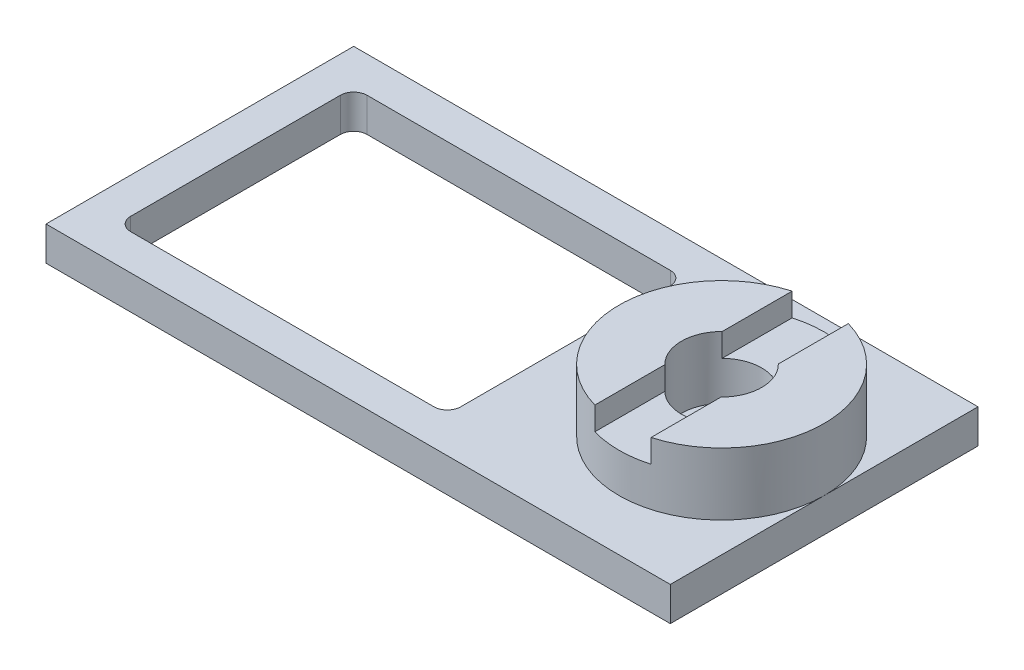
ISO-10303-21;
HEADER;
FILE_DESCRIPTION(('STEP AP214'),'2;1');
FILE_NAME('part.step','',(''),(''),'','','');
FILE_SCHEMA(('AUTOMOTIVE_DESIGN { 1 0 10303 214 1 1 1 1 }'));
ENDSEC;
DATA;
#1=APPLICATION_CONTEXT('core data for automotive mechanical design processes');
#2=APPLICATION_PROTOCOL_DEFINITION('international standard','automotive_design',2000,#1);
#3=PRODUCT_CONTEXT('',#1,'mechanical');
#4=PRODUCT('Part','Part','',(#3));
#5=PRODUCT_RELATED_PRODUCT_CATEGORY('part','',(#4));
#6=PRODUCT_DEFINITION_FORMATION('','',#4);
#7=PRODUCT_DEFINITION_CONTEXT('part definition',#1,'design');
#8=PRODUCT_DEFINITION('design','',#6,#7);
#9=PRODUCT_DEFINITION_SHAPE('','',#8);
#10=(LENGTH_UNIT() NAMED_UNIT(*) SI_UNIT(.MILLI.,.METRE.));
#11=(NAMED_UNIT(*) PLANE_ANGLE_UNIT() SI_UNIT($,.RADIAN.));
#12=(NAMED_UNIT(*) SI_UNIT($,.STERADIAN.) SOLID_ANGLE_UNIT());
#13=UNCERTAINTY_MEASURE_WITH_UNIT(LENGTH_MEASURE(1.E-05),#10,'distance_accuracy_value','');
#14=(GEOMETRIC_REPRESENTATION_CONTEXT(3) GLOBAL_UNCERTAINTY_ASSIGNED_CONTEXT((#13)) GLOBAL_UNIT_ASSIGNED_CONTEXT((#10,
#11,#12)) REPRESENTATION_CONTEXT('',''));
#15=CARTESIAN_POINT('',(0.,0.,0.));
#16=DIRECTION('',(0.,0.,1.));
#17=DIRECTION('',(1.,0.,0.));
#18=AXIS2_PLACEMENT_3D('',#15,#16,#17);
#19=CARTESIAN_POINT('',(235.,108.1,0.));
#20=DIRECTION('',(0.,1.,0.));
#21=DIRECTION('',(0.,0.,1.));
#22=AXIS2_PLACEMENT_3D('',#19,#20,#21);
#23=PLANE('',#22);
#24=DIRECTION('',(0.,0.,-1.));
#25=VECTOR('',#24,1.);
#26=CARTESIAN_POINT('',(266.5,108.1,123.537082836921));
#27=LINE('',#26,#25);
#28=CARTESIAN_POINT('',(266.5,108.1,110.601763096255));
#29=VERTEX_POINT('',#28);
#30=CARTESIAN_POINT('',(266.5,108.1,32.1364279284429));
#31=VERTEX_POINT('',#30);
#32=EDGE_CURVE('E179',#29,#31,#27,.T.);
#33=ORIENTED_EDGE('',*,*,#32,.F.);
#34=CARTESIAN_POINT('',(235.,108.1,0.));
#35=DIRECTION('',(0.,1.,0.));
#36=DIRECTION('',(0.,0.,1.));
#37=AXIS2_PLACEMENT_3D('',#34,#35,#36);
#38=CIRCLE('',#37,115.);
#39=CARTESIAN_POINT('',(266.5,108.1,-110.601763096255));
#40=VERTEX_POINT('',#39);
#41=EDGE_CURVE('E190',#29,#40,#38,.T.);
#42=ORIENTED_EDGE('',*,*,#41,.T.);
#43=CARTESIAN_POINT('',(266.5,108.1,-32.1364279284429));
#44=VERTEX_POINT('',#43);
#45=EDGE_CURVE('E194',#44,#40,#27,.T.);
#46=ORIENTED_EDGE('',*,*,#45,.F.);
#47=CARTESIAN_POINT('',(235.,108.1,0.));
#48=DIRECTION('',(0.,1.,0.));
#49=DIRECTION('',(0.,0.,1.));
#50=AXIS2_PLACEMENT_3D('',#47,#48,#49);
#51=CIRCLE('',#50,45.);
#52=EDGE_CURVE('E192',#31,#44,#51,.T.);
#53=ORIENTED_EDGE('',*,*,#52,.F.);
#54=EDGE_LOOP('',(#33,#42,#46,#53));
#55=FACE_BOUND('',#54,.T.);
#56=ADVANCED_FACE('F37',(#55),#23,.T.);
#57=CARTESIAN_POINT('',(350.,38.1,172.5));
#58=DIRECTION('',(-1.,0.,0.));
#59=DIRECTION('',(0.,0.,1.));
#60=AXIS2_PLACEMENT_3D('',#57,#58,#59);
#61=PLANE('',#60);
#62=DIRECTION('',(0.,0.,-1.));
#63=VECTOR('',#62,1.);
#64=CARTESIAN_POINT('',(350.,0.,172.5));
#65=LINE('',#64,#63);
#66=CARTESIAN_POINT('',(350.,0.,172.5));
#67=VERTEX_POINT('',#66);
#68=CARTESIAN_POINT('',(350.,0.,-172.5));
#69=VERTEX_POINT('',#68);
#70=EDGE_CURVE('E226',#67,#69,#65,.T.);
#71=ORIENTED_EDGE('',*,*,#70,.T.);
#72=DIRECTION('',(0.,-1.,0.));
#73=VECTOR('',#72,1.);
#74=CARTESIAN_POINT('',(350.,38.1,-172.5));
#75=LINE('',#74,#73);
#76=CARTESIAN_POINT('',(350.,38.1,-172.5));
#77=VERTEX_POINT('',#76);
#78=EDGE_CURVE('E261',#77,#69,#75,.T.);
#79=ORIENTED_EDGE('',*,*,#78,.F.);
#80=DIRECTION('',(0.,0.,-1.));
#81=VECTOR('',#80,1.);
#82=CARTESIAN_POINT('',(350.,38.1,172.5));
#83=LINE('',#82,#81);
#84=CARTESIAN_POINT('',(350.,38.1,0.));
#85=VERTEX_POINT('',#84);
#86=EDGE_CURVE('E238',#85,#77,#83,.T.);
#87=ORIENTED_EDGE('',*,*,#86,.F.);
#88=CARTESIAN_POINT('',(350.,38.1,172.5));
#89=VERTEX_POINT('',#88);
#90=EDGE_CURVE('E235',#89,#85,#83,.T.);
#91=ORIENTED_EDGE('',*,*,#90,.F.);
#92=DIRECTION('',(0.,-1.,0.));
#93=VECTOR('',#92,1.);
#94=CARTESIAN_POINT('',(350.,38.1,172.5));
#95=LINE('',#94,#93);
#96=EDGE_CURVE('E244',#89,#67,#95,.T.);
#97=ORIENTED_EDGE('',*,*,#96,.T.);
#98=EDGE_LOOP('',(#71,#79,#87,#91,#97));
#99=FACE_BOUND('',#98,.T.);
#100=ADVANCED_FACE('F361',(#99),#61,.F.);
#101=CARTESIAN_POINT('',(-350.,38.1,-172.5));
#102=DIRECTION('',(0.,0.,1.));
#103=DIRECTION('',(1.,0.,0.));
#104=AXIS2_PLACEMENT_3D('',#101,#102,#103);
#105=PLANE('',#104);
#106=DIRECTION('',(-1.,0.,0.));
#107=VECTOR('',#106,1.);
#108=CARTESIAN_POINT('',(-350.,0.,-172.5));
#109=LINE('',#108,#107);
#110=CARTESIAN_POINT('',(-350.,0.,-172.5));
#111=VERTEX_POINT('',#110);
#112=EDGE_CURVE('E247',#69,#111,#109,.T.);
#113=ORIENTED_EDGE('',*,*,#112,.T.);
#114=DIRECTION('',(0.,-1.,0.));
#115=VECTOR('',#114,1.);
#116=CARTESIAN_POINT('',(-350.,38.1,-172.5));
#117=LINE('',#116,#115);
#118=CARTESIAN_POINT('',(-350.,38.1,-172.5));
#119=VERTEX_POINT('',#118);
#120=EDGE_CURVE('E258',#119,#111,#117,.T.);
#121=ORIENTED_EDGE('',*,*,#120,.F.);
#122=DIRECTION('',(-1.,0.,0.));
#123=VECTOR('',#122,1.);
#124=CARTESIAN_POINT('',(-350.,38.1,-172.5));
#125=LINE('',#124,#123);
#126=EDGE_CURVE('E237',#77,#119,#125,.T.);
#127=ORIENTED_EDGE('',*,*,#126,.F.);
#128=ORIENTED_EDGE('',*,*,#78,.T.);
#129=EDGE_LOOP('',(#113,#121,#127,#128));
#130=FACE_BOUND('',#129,.T.);
#131=ADVANCED_FACE('F366',(#130),#105,.F.);
#132=CARTESIAN_POINT('',(-350.,38.1,172.5));
#133=DIRECTION('',(1.,0.,0.));
#134=DIRECTION('',(0.,0.,-1.));
#135=AXIS2_PLACEMENT_3D('',#132,#133,#134);
#136=PLANE('',#135);
#137=DIRECTION('',(0.,0.,1.));
#138=VECTOR('',#137,1.);
#139=CARTESIAN_POINT('',(-350.,0.,172.5));
#140=LINE('',#139,#138);
#141=CARTESIAN_POINT('',(-350.,0.,172.5));
#142=VERTEX_POINT('',#141);
#143=EDGE_CURVE('E249',#111,#142,#140,.T.);
#144=ORIENTED_EDGE('',*,*,#143,.T.);
#145=DIRECTION('',(0.,-1.,0.));
#146=VECTOR('',#145,1.);
#147=CARTESIAN_POINT('',(-350.,38.1,172.5));
#148=LINE('',#147,#146);
#149=CARTESIAN_POINT('',(-350.,38.1,172.5));
#150=VERTEX_POINT('',#149);
#151=EDGE_CURVE('E255',#150,#142,#148,.T.);
#152=ORIENTED_EDGE('',*,*,#151,.F.);
#153=DIRECTION('',(0.,0.,1.));
#154=VECTOR('',#153,1.);
#155=CARTESIAN_POINT('',(-350.,38.1,172.5));
#156=LINE('',#155,#154);
#157=EDGE_CURVE('E240',#119,#150,#156,.T.);
#158=ORIENTED_EDGE('',*,*,#157,.F.);
#159=ORIENTED_EDGE('',*,*,#120,.T.);
#160=EDGE_LOOP('',(#144,#152,#158,#159));
#161=FACE_BOUND('',#160,.T.);
#162=ADVANCED_FACE('F411',(#161),#136,.F.);
#163=CARTESIAN_POINT('',(-350.,38.1,172.5));
#164=DIRECTION('',(0.,0.,-1.));
#165=DIRECTION('',(-1.,0.,0.));
#166=AXIS2_PLACEMENT_3D('',#163,#164,#165);
#167=PLANE('',#166);
#168=DIRECTION('',(1.,0.,0.));
#169=VECTOR('',#168,1.);
#170=CARTESIAN_POINT('',(-350.,0.,172.5));
#171=LINE('',#170,#169);
#172=EDGE_CURVE('E251',#142,#67,#171,.T.);
#173=ORIENTED_EDGE('',*,*,#172,.T.);
#174=ORIENTED_EDGE('',*,*,#96,.F.);
#175=DIRECTION('',(1.,0.,0.));
#176=VECTOR('',#175,1.);
#177=CARTESIAN_POINT('',(-350.,38.1,172.5));
#178=LINE('',#177,#176);
#179=EDGE_CURVE('E242',#150,#89,#178,.T.);
#180=ORIENTED_EDGE('',*,*,#179,.F.);
#181=ORIENTED_EDGE('',*,*,#151,.T.);
#182=EDGE_LOOP('',(#173,#174,#180,#181));
#183=FACE_BOUND('',#182,.T.);
#184=ADVANCED_FACE('F404',(#183),#167,.F.);
#185=CARTESIAN_POINT('',(0.,38.1,0.));
#186=DIRECTION('',(0.,-1.,0.));
#187=DIRECTION('',(0.,0.,-1.));
#188=AXIS2_PLACEMENT_3D('',#185,#186,#187);
#189=PLANE('',#188);
#190=DIRECTION('',(1.,0.,0.));
#191=VECTOR('',#190,1.);
#192=CARTESIAN_POINT('',(60.0000000000001,38.1,132.5));
#193=LINE('',#192,#191);
#194=CARTESIAN_POINT('',(-295.,38.1,132.5));
#195=VERTEX_POINT('',#194);
#196=CARTESIAN_POINT('',(45.0000000000001,38.1,132.5));
#197=VERTEX_POINT('',#196);
#198=EDGE_CURVE('E204',#195,#197,#193,.T.);
#199=ORIENTED_EDGE('',*,*,#198,.F.);
#200=CARTESIAN_POINT('',(-295.,38.1,117.5));
#201=DIRECTION('',(0.,-1.,0.));
#202=DIRECTION('',(0.,0.,-1.));
#203=AXIS2_PLACEMENT_3D('',#200,#201,#202);
#204=CIRCLE('',#203,15.);
#205=CARTESIAN_POINT('',(-310.,38.1,117.5));
#206=VERTEX_POINT('',#205);
#207=EDGE_CURVE('E288',#195,#206,#204,.T.);
#208=ORIENTED_EDGE('',*,*,#207,.T.);
#209=DIRECTION('',(0.,0.,1.));
#210=VECTOR('',#209,1.);
#211=CARTESIAN_POINT('',(-310.,38.1,132.5));
#212=LINE('',#211,#210);
#213=CARTESIAN_POINT('',(-310.,38.1,-117.5));
#214=VERTEX_POINT('',#213);
#215=EDGE_CURVE('E200',#214,#206,#212,.T.);
#216=ORIENTED_EDGE('',*,*,#215,.F.);
#217=CARTESIAN_POINT('',(-295.,38.1,-117.5));
#218=DIRECTION('',(0.,-1.,0.));
#219=DIRECTION('',(0.,0.,-1.));
#220=AXIS2_PLACEMENT_3D('',#217,#218,#219);
#221=CIRCLE('',#220,15.);
#222=CARTESIAN_POINT('',(-295.,38.1,-132.5));
#223=VERTEX_POINT('',#222);
#224=EDGE_CURVE('E284',#214,#223,#221,.T.);
#225=ORIENTED_EDGE('',*,*,#224,.T.);
#226=DIRECTION('',(-1.,0.,0.));
#227=VECTOR('',#226,1.);
#228=CARTESIAN_POINT('',(60.0000000000001,38.1,-132.5));
#229=LINE('',#228,#227);
#230=CARTESIAN_POINT('',(45.0000000000001,38.1,-132.5));
#231=VERTEX_POINT('',#230);
#232=EDGE_CURVE('E218',#231,#223,#229,.T.);
#233=ORIENTED_EDGE('',*,*,#232,.F.);
#234=CARTESIAN_POINT('',(45.0000000000001,38.1,-117.5));
#235=DIRECTION('',(0.,-1.,0.));
#236=DIRECTION('',(0.,0.,-1.));
#237=AXIS2_PLACEMENT_3D('',#234,#235,#236);
#238=CIRCLE('',#237,15.);
#239=CARTESIAN_POINT('',(60.0000000000001,38.1,-117.5));
#240=VERTEX_POINT('',#239);
#241=EDGE_CURVE('E296',#231,#240,#238,.T.);
#242=ORIENTED_EDGE('',*,*,#241,.T.);
#243=DIRECTION('',(0.,0.,-1.));
#244=VECTOR('',#243,1.);
#245=CARTESIAN_POINT('',(60.0000000000001,38.1,132.5));
#246=LINE('',#245,#244);
#247=CARTESIAN_POINT('',(60.0000000000001,38.1,117.5));
#248=VERTEX_POINT('',#247);
#249=EDGE_CURVE('E230',#248,#240,#246,.T.);
#250=ORIENTED_EDGE('',*,*,#249,.F.);
#251=CARTESIAN_POINT('',(45.0000000000001,38.1,117.5));
#252=DIRECTION('',(0.,-1.,0.));
#253=DIRECTION('',(0.,0.,-1.));
#254=AXIS2_PLACEMENT_3D('',#251,#252,#253);
#255=CIRCLE('',#254,15.);
#256=EDGE_CURVE('E292',#248,#197,#255,.T.);
#257=ORIENTED_EDGE('',*,*,#256,.T.);
#258=EDGE_LOOP('',(#199,#208,#216,#225,#233,#242,#250,#257));
#259=FACE_BOUND('',#258,.T.);
#260=ORIENTED_EDGE('',*,*,#90,.T.);
#261=CARTESIAN_POINT('',(235.,38.1,0.));
#262=DIRECTION('',(0.,1.,0.));
#263=DIRECTION('',(0.,0.,1.));
#264=AXIS2_PLACEMENT_3D('',#261,#262,#263);
#265=CIRCLE('',#264,115.);
#266=EDGE_CURVE('E207',#85,#85,#265,.T.);
#267=ORIENTED_EDGE('',*,*,#266,.F.);
#268=ORIENTED_EDGE('',*,*,#86,.T.);
#269=ORIENTED_EDGE('',*,*,#126,.T.);
#270=ORIENTED_EDGE('',*,*,#157,.T.);
#271=ORIENTED_EDGE('',*,*,#179,.T.);
#272=EDGE_LOOP('',(#260,#267,#268,#269,#270,#271));
#273=FACE_BOUND('',#272,.T.);
#274=ADVANCED_FACE('F401',(#259,#273),#189,.F.);
#275=CARTESIAN_POINT('',(0.,0.,0.));
#276=DIRECTION('',(0.,-1.,0.));
#277=DIRECTION('',(0.,0.,-1.));
#278=AXIS2_PLACEMENT_3D('',#275,#276,#277);
#279=PLANE('',#278);
#280=DIRECTION('',(-1.,0.,0.));
#281=VECTOR('',#280,1.);
#282=CARTESIAN_POINT('',(60.0000000000001,0.,-132.5));
#283=LINE('',#282,#281);
#284=CARTESIAN_POINT('',(45.0000000000001,0.,-132.5));
#285=VERTEX_POINT('',#284);
#286=CARTESIAN_POINT('',(-295.,0.,-132.5));
#287=VERTEX_POINT('',#286);
#288=EDGE_CURVE('E224',#285,#287,#283,.T.);
#289=ORIENTED_EDGE('',*,*,#288,.T.);
#290=CARTESIAN_POINT('',(-295.,0.,-117.5));
#291=DIRECTION('',(0.,-1.,0.));
#292=DIRECTION('',(0.,0.,-1.));
#293=AXIS2_PLACEMENT_3D('',#290,#291,#292);
#294=CIRCLE('',#293,15.);
#295=CARTESIAN_POINT('',(-310.,0.,-117.5));
#296=VERTEX_POINT('',#295);
#297=EDGE_CURVE('E286',#287,#296,#294,.F.);
#298=ORIENTED_EDGE('',*,*,#297,.T.);
#299=DIRECTION('',(0.,0.,1.));
#300=VECTOR('',#299,1.);
#301=CARTESIAN_POINT('',(-310.,0.,132.5));
#302=LINE('',#301,#300);
#303=CARTESIAN_POINT('',(-310.,0.,117.5));
#304=VERTEX_POINT('',#303);
#305=EDGE_CURVE('E214',#296,#304,#302,.T.);
#306=ORIENTED_EDGE('',*,*,#305,.T.);
#307=CARTESIAN_POINT('',(-295.,0.,117.5));
#308=DIRECTION('',(0.,-1.,0.));
#309=DIRECTION('',(0.,0.,-1.));
#310=AXIS2_PLACEMENT_3D('',#307,#308,#309);
#311=CIRCLE('',#310,15.);
#312=CARTESIAN_POINT('',(-295.,0.,132.5));
#313=VERTEX_POINT('',#312);
#314=EDGE_CURVE('E290',#304,#313,#311,.F.);
#315=ORIENTED_EDGE('',*,*,#314,.T.);
#316=DIRECTION('',(1.,0.,0.));
#317=VECTOR('',#316,1.);
#318=CARTESIAN_POINT('',(60.0000000000001,0.,132.5));
#319=LINE('',#318,#317);
#320=CARTESIAN_POINT('',(45.0000000000001,0.,132.5));
#321=VERTEX_POINT('',#320);
#322=EDGE_CURVE('E217',#313,#321,#319,.T.);
#323=ORIENTED_EDGE('',*,*,#322,.T.);
#324=CARTESIAN_POINT('',(45.0000000000001,0.,117.5));
#325=DIRECTION('',(0.,-1.,0.));
#326=DIRECTION('',(0.,0.,-1.));
#327=AXIS2_PLACEMENT_3D('',#324,#325,#326);
#328=CIRCLE('',#327,15.);
#329=CARTESIAN_POINT('',(60.0000000000001,0.,117.5));
#330=VERTEX_POINT('',#329);
#331=EDGE_CURVE('E294',#321,#330,#328,.F.);
#332=ORIENTED_EDGE('',*,*,#331,.T.);
#333=DIRECTION('',(0.,0.,-1.));
#334=VECTOR('',#333,1.);
#335=CARTESIAN_POINT('',(60.0000000000001,0.,132.5));
#336=LINE('',#335,#334);
#337=CARTESIAN_POINT('',(60.0000000000001,0.,-117.5));
#338=VERTEX_POINT('',#337);
#339=EDGE_CURVE('E221',#330,#338,#336,.T.);
#340=ORIENTED_EDGE('',*,*,#339,.T.);
#341=CARTESIAN_POINT('',(45.0000000000001,0.,-117.5));
#342=DIRECTION('',(0.,-1.,0.));
#343=DIRECTION('',(0.,0.,-1.));
#344=AXIS2_PLACEMENT_3D('',#341,#342,#343);
#345=CIRCLE('',#344,15.);
#346=EDGE_CURVE('E298',#338,#285,#345,.F.);
#347=ORIENTED_EDGE('',*,*,#346,.T.);
#348=EDGE_LOOP('',(#289,#298,#306,#315,#323,#332,#340,#347));
#349=FACE_BOUND('',#348,.T.);
#350=ORIENTED_EDGE('',*,*,#70,.F.);
#351=ORIENTED_EDGE('',*,*,#172,.F.);
#352=ORIENTED_EDGE('',*,*,#143,.F.);
#353=ORIENTED_EDGE('',*,*,#112,.F.);
#354=EDGE_LOOP('',(#350,#351,#352,#353));
#355=FACE_BOUND('',#354,.T.);
#356=ADVANCED_FACE('F399',(#349,#355),#279,.T.);
#357=CARTESIAN_POINT('',(-310.,0.,132.5));
#358=DIRECTION('',(-1.,0.,0.));
#359=DIRECTION('',(0.,0.,1.));
#360=AXIS2_PLACEMENT_3D('',#357,#358,#359);
#361=PLANE('',#360);
#362=ORIENTED_EDGE('',*,*,#305,.F.);
#363=DIRECTION('',(0.,1.,0.));
#364=VECTOR('',#363,1.);
#365=CARTESIAN_POINT('',(-310.,38.1,-117.5));
#366=LINE('',#365,#364);
#367=EDGE_CURVE('E266',#296,#214,#366,.T.);
#368=ORIENTED_EDGE('',*,*,#367,.T.);
#369=ORIENTED_EDGE('',*,*,#215,.T.);
#370=DIRECTION('',(0.,1.,0.));
#371=VECTOR('',#370,1.);
#372=CARTESIAN_POINT('',(-310.,0.,117.5));
#373=LINE('',#372,#371);
#374=EDGE_CURVE('E264',#206,#304,#373,.F.);
#375=ORIENTED_EDGE('',*,*,#374,.T.);
#376=EDGE_LOOP('',(#362,#368,#369,#375));
#377=FACE_BOUND('',#376,.T.);
#378=ADVANCED_FACE('F387',(#377),#361,.F.);
#379=CARTESIAN_POINT('',(60.0000000000001,0.,-132.5));
#380=DIRECTION('',(0.,0.,-1.));
#381=DIRECTION('',(-1.,0.,0.));
#382=AXIS2_PLACEMENT_3D('',#379,#380,#381);
#383=PLANE('',#382);
#384=ORIENTED_EDGE('',*,*,#232,.T.);
#385=DIRECTION('',(0.,1.,0.));
#386=VECTOR('',#385,1.);
#387=CARTESIAN_POINT('',(-295.,0.,-132.5));
#388=LINE('',#387,#386);
#389=EDGE_CURVE('E272',#223,#287,#388,.F.);
#390=ORIENTED_EDGE('',*,*,#389,.T.);
#391=ORIENTED_EDGE('',*,*,#288,.F.);
#392=DIRECTION('',(0.,1.,0.));
#393=VECTOR('',#392,1.);
#394=CARTESIAN_POINT('',(45.0000000000001,38.1,-132.5));
#395=LINE('',#394,#393);
#396=EDGE_CURVE('E269',#285,#231,#395,.T.);
#397=ORIENTED_EDGE('',*,*,#396,.T.);
#398=EDGE_LOOP('',(#384,#390,#391,#397));
#399=FACE_BOUND('',#398,.T.);
#400=ADVANCED_FACE('F383',(#399),#383,.F.);
#401=CARTESIAN_POINT('',(60.0000000000001,0.,132.5));
#402=DIRECTION('',(1.,0.,0.));
#403=DIRECTION('',(0.,0.,-1.));
#404=AXIS2_PLACEMENT_3D('',#401,#402,#403);
#405=PLANE('',#404);
#406=ORIENTED_EDGE('',*,*,#339,.F.);
#407=DIRECTION('',(0.,1.,0.));
#408=VECTOR('',#407,1.);
#409=CARTESIAN_POINT('',(60.0000000000001,38.1,117.5));
#410=LINE('',#409,#408);
#411=EDGE_CURVE('E281',#330,#248,#410,.T.);
#412=ORIENTED_EDGE('',*,*,#411,.T.);
#413=ORIENTED_EDGE('',*,*,#249,.T.);
#414=DIRECTION('',(0.,1.,0.));
#415=VECTOR('',#414,1.);
#416=CARTESIAN_POINT('',(60.0000000000001,0.,-117.5));
#417=LINE('',#416,#415);
#418=EDGE_CURVE('E279',#240,#338,#417,.F.);
#419=ORIENTED_EDGE('',*,*,#418,.T.);
#420=EDGE_LOOP('',(#406,#412,#413,#419));
#421=FACE_BOUND('',#420,.T.);
#422=ADVANCED_FACE('F386',(#421),#405,.F.);
#423=CARTESIAN_POINT('',(60.0000000000001,0.,132.5));
#424=DIRECTION('',(0.,0.,1.));
#425=DIRECTION('',(1.,0.,0.));
#426=AXIS2_PLACEMENT_3D('',#423,#424,#425);
#427=PLANE('',#426);
#428=ORIENTED_EDGE('',*,*,#322,.F.);
#429=DIRECTION('',(0.,1.,0.));
#430=VECTOR('',#429,1.);
#431=CARTESIAN_POINT('',(-295.,38.1,132.5));
#432=LINE('',#431,#430);
#433=EDGE_CURVE('E276',#313,#195,#432,.T.);
#434=ORIENTED_EDGE('',*,*,#433,.T.);
#435=ORIENTED_EDGE('',*,*,#198,.T.);
#436=DIRECTION('',(0.,1.,0.));
#437=VECTOR('',#436,1.);
#438=CARTESIAN_POINT('',(45.0000000000001,0.,132.5));
#439=LINE('',#438,#437);
#440=EDGE_CURVE('E274',#197,#321,#439,.F.);
#441=ORIENTED_EDGE('',*,*,#440,.T.);
#442=EDGE_LOOP('',(#428,#434,#435,#441));
#443=FACE_BOUND('',#442,.T.);
#444=ADVANCED_FACE('F391',(#443),#427,.F.);
#445=CARTESIAN_POINT('',(-295.,0.,-117.5));
#446=DIRECTION('',(0.,-1.,0.));
#447=DIRECTION('',(0.,0.,-1.));
#448=AXIS2_PLACEMENT_3D('',#445,#446,#447);
#449=CYLINDRICAL_SURFACE('',#448,15.);
#450=ORIENTED_EDGE('',*,*,#297,.F.);
#451=ORIENTED_EDGE('',*,*,#389,.F.);
#452=ORIENTED_EDGE('',*,*,#224,.F.);
#453=ORIENTED_EDGE('',*,*,#367,.F.);
#454=EDGE_LOOP('',(#450,#451,#452,#453));
#455=FACE_BOUND('',#454,.T.);
#456=ADVANCED_FACE('F395',(#455),#449,.F.);
#457=CARTESIAN_POINT('',(-295.,0.,117.5));
#458=DIRECTION('',(0.,-1.,0.));
#459=DIRECTION('',(0.,0.,-1.));
#460=AXIS2_PLACEMENT_3D('',#457,#458,#459);
#461=CYLINDRICAL_SURFACE('',#460,15.);
#462=ORIENTED_EDGE('',*,*,#314,.F.);
#463=ORIENTED_EDGE('',*,*,#374,.F.);
#464=ORIENTED_EDGE('',*,*,#207,.F.);
#465=ORIENTED_EDGE('',*,*,#433,.F.);
#466=EDGE_LOOP('',(#462,#463,#464,#465));
#467=FACE_BOUND('',#466,.T.);
#468=ADVANCED_FACE('F421',(#467),#461,.F.);
#469=CARTESIAN_POINT('',(45.0000000000001,0.,117.5));
#470=DIRECTION('',(0.,-1.,0.));
#471=DIRECTION('',(0.,0.,-1.));
#472=AXIS2_PLACEMENT_3D('',#469,#470,#471);
#473=CYLINDRICAL_SURFACE('',#472,15.);
#474=ORIENTED_EDGE('',*,*,#331,.F.);
#475=ORIENTED_EDGE('',*,*,#440,.F.);
#476=ORIENTED_EDGE('',*,*,#256,.F.);
#477=ORIENTED_EDGE('',*,*,#411,.F.);
#478=EDGE_LOOP('',(#474,#475,#476,#477));
#479=FACE_BOUND('',#478,.T.);
#480=ADVANCED_FACE('F380',(#479),#473,.F.);
#481=CARTESIAN_POINT('',(45.0000000000001,0.,-117.5));
#482=DIRECTION('',(0.,-1.,0.));
#483=DIRECTION('',(0.,0.,-1.));
#484=AXIS2_PLACEMENT_3D('',#481,#482,#483);
#485=CYLINDRICAL_SURFACE('',#484,15.);
#486=ORIENTED_EDGE('',*,*,#346,.F.);
#487=ORIENTED_EDGE('',*,*,#418,.F.);
#488=ORIENTED_EDGE('',*,*,#241,.F.);
#489=ORIENTED_EDGE('',*,*,#396,.F.);
#490=EDGE_LOOP('',(#486,#487,#488,#489));
#491=FACE_BOUND('',#490,.T.);
#492=ADVANCED_FACE('F39',(#491),#485,.F.);
#493=CARTESIAN_POINT('',(235.,108.1,0.));
#494=DIRECTION('',(0.,-1.,0.));
#495=DIRECTION('',(0.,0.,-1.));
#496=AXIS2_PLACEMENT_3D('',#493,#494,#495);
#497=CYLINDRICAL_SURFACE('',#496,115.);
#498=ORIENTED_EDGE('',*,*,#41,.F.);
#499=DIRECTION('',(0.,-1.,0.));
#500=VECTOR('',#499,1.);
#501=CARTESIAN_POINT('',(266.5,108.1,110.601763096255));
#502=LINE('',#501,#500);
#503=CARTESIAN_POINT('',(266.5,82.1,110.601763096255));
#504=VERTEX_POINT('',#503);
#505=EDGE_CURVE('E176',#29,#504,#502,.T.);
#506=ORIENTED_EDGE('',*,*,#505,.T.);
#507=CARTESIAN_POINT('',(235.,82.1,0.));
#508=DIRECTION('',(0.,-1.,0.));
#509=DIRECTION('',(0.,0.,-1.));
#510=AXIS2_PLACEMENT_3D('',#507,#508,#509);
#511=CIRCLE('',#510,115.);
#512=CARTESIAN_POINT('',(203.5,82.1,110.601763096254));
#513=VERTEX_POINT('',#512);
#514=EDGE_CURVE('E332',#504,#513,#511,.T.);
#515=ORIENTED_EDGE('',*,*,#514,.T.);
#516=DIRECTION('',(0.,-1.,0.));
#517=VECTOR('',#516,1.);
#518=CARTESIAN_POINT('',(203.5,108.1,110.601763096254));
#519=LINE('',#518,#517);
#520=CARTESIAN_POINT('',(203.5,108.1,110.601763096254));
#521=VERTEX_POINT('',#520);
#522=EDGE_CURVE('E323',#513,#521,#519,.F.);
#523=ORIENTED_EDGE('',*,*,#522,.T.);
#524=CARTESIAN_POINT('',(203.5,108.1,-110.601763096254));
#525=VERTEX_POINT('',#524);
#526=EDGE_CURVE('E201',#525,#521,#38,.T.);
#527=ORIENTED_EDGE('',*,*,#526,.F.);
#528=DIRECTION('',(0.,-1.,0.));
#529=VECTOR('',#528,1.);
#530=CARTESIAN_POINT('',(203.5,108.1,-110.601763096254));
#531=LINE('',#530,#529);
#532=CARTESIAN_POINT('',(203.5,82.1,-110.601763096254));
#533=VERTEX_POINT('',#532);
#534=EDGE_CURVE('E334',#525,#533,#531,.T.);
#535=ORIENTED_EDGE('',*,*,#534,.T.);
#536=CARTESIAN_POINT('',(266.5,82.1,-110.601763096255));
#537=VERTEX_POINT('',#536);
#538=EDGE_CURVE('E325',#533,#537,#511,.T.);
#539=ORIENTED_EDGE('',*,*,#538,.T.);
#540=DIRECTION('',(0.,-1.,0.));
#541=VECTOR('',#540,1.);
#542=CARTESIAN_POINT('',(266.5,108.1,-110.601763096255));
#543=LINE('',#542,#541);
#544=EDGE_CURVE('E184',#537,#40,#543,.F.);
#545=ORIENTED_EDGE('',*,*,#544,.T.);
#546=EDGE_LOOP('',(#498,#506,#515,#523,#527,#535,#539,#545));
#547=FACE_BOUND('',#546,.T.);
#548=ORIENTED_EDGE('',*,*,#266,.T.);
#549=EDGE_LOOP('',(#548));
#550=FACE_BOUND('',#549,.T.);
#551=ADVANCED_FACE('F197',(#547,#550),#497,.T.);
#552=DIRECTION('',(0.,0.,1.));
#553=VECTOR('',#552,1.);
#554=CARTESIAN_POINT('',(203.5,108.1,123.537082836921));
#555=LINE('',#554,#553);
#556=CARTESIAN_POINT('',(203.5,108.1,-32.1364279284428));
#557=VERTEX_POINT('',#556);
#558=EDGE_CURVE('E330',#525,#557,#555,.T.);
#559=ORIENTED_EDGE('',*,*,#558,.F.);
#560=ORIENTED_EDGE('',*,*,#526,.T.);
#561=CARTESIAN_POINT('',(203.5,108.1,32.1364279284428));
#562=VERTEX_POINT('',#561);
#563=EDGE_CURVE('E193',#562,#521,#555,.T.);
#564=ORIENTED_EDGE('',*,*,#563,.F.);
#565=EDGE_CURVE('E183',#557,#562,#51,.T.);
#566=ORIENTED_EDGE('',*,*,#565,.F.);
#567=EDGE_LOOP('',(#559,#560,#564,#566));
#568=FACE_BOUND('',#567,.T.);
#569=ADVANCED_FACE('F343',(#568),#23,.T.);
#570=CARTESIAN_POINT('',(235.,38.1,0.));
#571=DIRECTION('',(0.,1.,0.));
#572=DIRECTION('',(0.,0.,1.));
#573=AXIS2_PLACEMENT_3D('',#570,#571,#572);
#574=CYLINDRICAL_SURFACE('',#573,45.);
#575=CARTESIAN_POINT('',(235.,82.1,0.));
#576=DIRECTION('',(0.,-1.,0.));
#577=DIRECTION('',(0.,0.,-1.));
#578=AXIS2_PLACEMENT_3D('',#575,#576,#577);
#579=CIRCLE('',#578,45.);
#580=CARTESIAN_POINT('',(203.5,82.1,32.1364279284428));
#581=VERTEX_POINT('',#580);
#582=CARTESIAN_POINT('',(266.5,82.1,32.1364279284429));
#583=VERTEX_POINT('',#582);
#584=EDGE_CURVE('E304',#581,#583,#579,.F.);
#585=ORIENTED_EDGE('',*,*,#584,.T.);
#586=DIRECTION('',(0.,1.,0.));
#587=VECTOR('',#586,1.);
#588=CARTESIAN_POINT('',(266.5,38.1,32.1364279284428));
#589=LINE('',#588,#587);
#590=EDGE_CURVE('E11',#583,#31,#589,.T.);
#591=ORIENTED_EDGE('',*,*,#590,.T.);
#592=ORIENTED_EDGE('',*,*,#52,.T.);
#593=DIRECTION('',(0.,1.,0.));
#594=VECTOR('',#593,1.);
#595=CARTESIAN_POINT('',(266.5,38.1,-32.1364279284428));
#596=LINE('',#595,#594);
#597=CARTESIAN_POINT('',(266.5,82.1,-32.1364279284429));
#598=VERTEX_POINT('',#597);
#599=EDGE_CURVE('E307',#44,#598,#596,.F.);
#600=ORIENTED_EDGE('',*,*,#599,.T.);
#601=CARTESIAN_POINT('',(203.5,82.1,-32.1364279284428));
#602=VERTEX_POINT('',#601);
#603=EDGE_CURVE('E300',#598,#602,#579,.F.);
#604=ORIENTED_EDGE('',*,*,#603,.T.);
#605=DIRECTION('',(0.,1.,0.));
#606=VECTOR('',#605,1.);
#607=CARTESIAN_POINT('',(203.5,38.1,-32.1364279284427));
#608=LINE('',#607,#606);
#609=EDGE_CURVE('E303',#602,#557,#608,.T.);
#610=ORIENTED_EDGE('',*,*,#609,.T.);
#611=ORIENTED_EDGE('',*,*,#565,.T.);
#612=DIRECTION('',(0.,1.,0.));
#613=VECTOR('',#612,1.);
#614=CARTESIAN_POINT('',(203.5,38.1,32.1364279284427));
#615=LINE('',#614,#613);
#616=EDGE_CURVE('E45',#562,#581,#615,.F.);
#617=ORIENTED_EDGE('',*,*,#616,.T.);
#618=EDGE_LOOP('',(#585,#591,#592,#600,#604,#610,#611,#617));
#619=FACE_BOUND('',#618,.T.);
#620=CARTESIAN_POINT('',(235.,38.1,0.));
#621=DIRECTION('',(0.,1.,0.));
#622=DIRECTION('',(0.,0.,1.));
#623=AXIS2_PLACEMENT_3D('',#620,#621,#622);
#624=CIRCLE('',#623,45.);
#625=CARTESIAN_POINT('',(235.,38.1,45.));
#626=VERTEX_POINT('',#625);
#627=EDGE_CURVE('E213',#626,#626,#624,.T.);
#628=ORIENTED_EDGE('',*,*,#627,.F.);
#629=EDGE_LOOP('',(#628));
#630=FACE_BOUND('',#629,.T.);
#631=ADVANCED_FACE('F313',(#619,#630),#574,.F.);
#632=CARTESIAN_POINT('',(235.,38.1,0.));
#633=DIRECTION('',(0.,1.,0.));
#634=DIRECTION('',(0.,0.,1.));
#635=AXIS2_PLACEMENT_3D('',#632,#633,#634);
#636=PLANE('',#635);
#637=ORIENTED_EDGE('',*,*,#627,.T.);
#638=EDGE_LOOP('',(#637));
#639=FACE_BOUND('',#638,.T.);
#640=ADVANCED_FACE('F376',(#639),#636,.T.);
#641=CARTESIAN_POINT('',(0.,82.1,0.));
#642=DIRECTION('',(0.,-1.,0.));
#643=DIRECTION('',(0.,0.,-1.));
#644=AXIS2_PLACEMENT_3D('',#641,#642,#643);
#645=PLANE('',#644);
#646=DIRECTION('',(0.,0.,1.));
#647=VECTOR('',#646,1.);
#648=CARTESIAN_POINT('',(203.5,82.1,123.537082836921));
#649=LINE('',#648,#647);
#650=EDGE_CURVE('E60',#533,#602,#649,.T.);
#651=ORIENTED_EDGE('',*,*,#650,.T.);
#652=ORIENTED_EDGE('',*,*,#603,.F.);
#653=DIRECTION('',(0.,0.,-1.));
#654=VECTOR('',#653,1.);
#655=CARTESIAN_POINT('',(266.5,82.1,123.537082836921));
#656=LINE('',#655,#654);
#657=EDGE_CURVE('E326',#598,#537,#656,.T.);
#658=ORIENTED_EDGE('',*,*,#657,.T.);
#659=ORIENTED_EDGE('',*,*,#538,.F.);
#660=EDGE_LOOP('',(#651,#652,#658,#659));
#661=FACE_BOUND('',#660,.T.);
#662=ADVANCED_FACE('F349',(#661),#645,.F.);
#663=CARTESIAN_POINT('',(203.5,82.1,123.537082836921));
#664=DIRECTION('',(-1.,0.,0.));
#665=DIRECTION('',(0.,0.,1.));
#666=AXIS2_PLACEMENT_3D('',#663,#664,#665);
#667=PLANE('',#666);
#668=ORIENTED_EDGE('',*,*,#558,.T.);
#669=ORIENTED_EDGE('',*,*,#609,.F.);
#670=ORIENTED_EDGE('',*,*,#650,.F.);
#671=ORIENTED_EDGE('',*,*,#534,.F.);
#672=EDGE_LOOP('',(#668,#669,#670,#671));
#673=FACE_BOUND('',#672,.T.);
#674=ADVANCED_FACE('F346',(#673),#667,.F.);
#675=CARTESIAN_POINT('',(266.5,82.1,123.537082836921));
#676=DIRECTION('',(1.,0.,0.));
#677=DIRECTION('',(0.,0.,-1.));
#678=AXIS2_PLACEMENT_3D('',#675,#676,#677);
#679=PLANE('',#678);
#680=ORIENTED_EDGE('',*,*,#657,.F.);
#681=ORIENTED_EDGE('',*,*,#599,.F.);
#682=ORIENTED_EDGE('',*,*,#45,.T.);
#683=ORIENTED_EDGE('',*,*,#544,.F.);
#684=EDGE_LOOP('',(#680,#681,#682,#683));
#685=FACE_BOUND('',#684,.T.);
#686=ADVANCED_FACE('F351',(#685),#679,.F.);
#687=ORIENTED_EDGE('',*,*,#32,.T.);
#688=ORIENTED_EDGE('',*,*,#590,.F.);
#689=EDGE_CURVE('E52',#504,#583,#656,.T.);
#690=ORIENTED_EDGE('',*,*,#689,.F.);
#691=ORIENTED_EDGE('',*,*,#505,.F.);
#692=EDGE_LOOP('',(#687,#688,#690,#691));
#693=FACE_BOUND('',#692,.T.);
#694=ADVANCED_FACE('F178',(#693),#679,.F.);
#695=EDGE_CURVE('E318',#581,#513,#649,.T.);
#696=ORIENTED_EDGE('',*,*,#695,.F.);
#697=ORIENTED_EDGE('',*,*,#616,.F.);
#698=ORIENTED_EDGE('',*,*,#563,.T.);
#699=ORIENTED_EDGE('',*,*,#522,.F.);
#700=EDGE_LOOP('',(#696,#697,#698,#699));
#701=FACE_BOUND('',#700,.T.);
#702=ADVANCED_FACE('F320',(#701),#667,.F.);
#703=ORIENTED_EDGE('',*,*,#689,.T.);
#704=ORIENTED_EDGE('',*,*,#584,.F.);
#705=ORIENTED_EDGE('',*,*,#695,.T.);
#706=ORIENTED_EDGE('',*,*,#514,.F.);
#707=EDGE_LOOP('',(#703,#704,#705,#706));
#708=FACE_BOUND('',#707,.T.);
#709=ADVANCED_FACE('F317',(#708),#645,.F.);
#710=CLOSED_SHELL('',(#56,#100,#131,#162,#184,#274,#356,#378,#400,#422,#444,#456,#468,#480,#492,
#551,#569,#631,#640,#662,#674,#686,#694,#702,#709));
#711=MANIFOLD_SOLID_BREP('B2',#710);
#712=ADVANCED_BREP_SHAPE_REPRESENTATION('',(#18,#711),#14);
#713=SHAPE_DEFINITION_REPRESENTATION(#9,#712);
ENDSEC;
END-ISO-10303-21;
